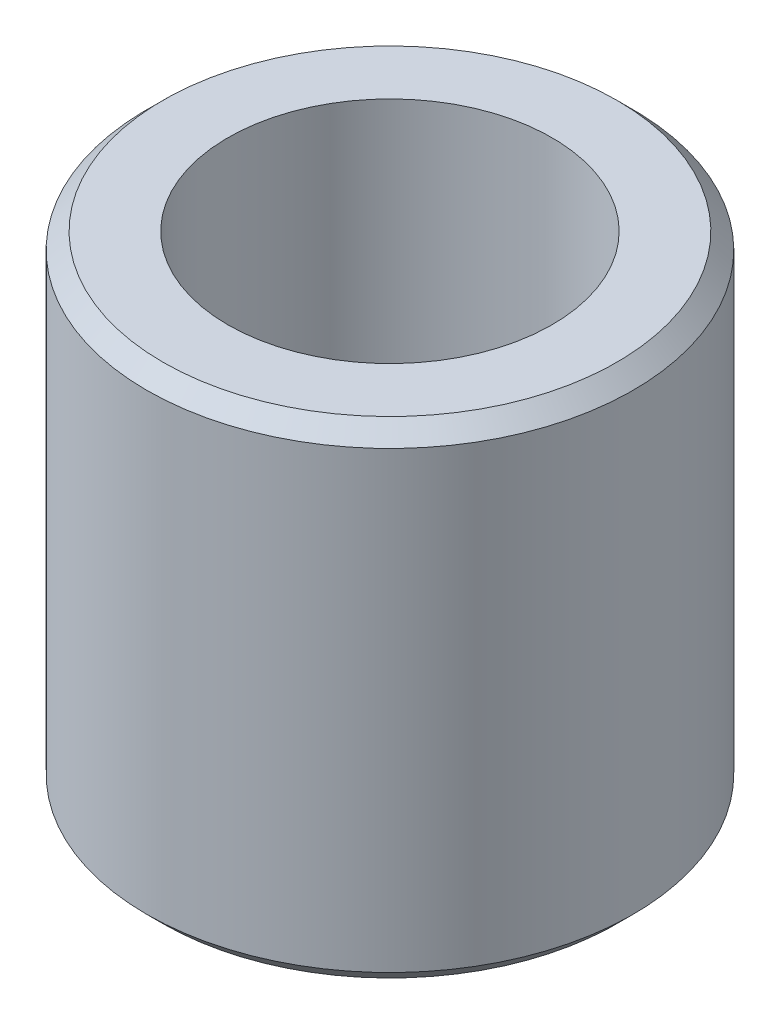
ISO-10303-21;
HEADER;
FILE_DESCRIPTION(('STEP AP214'),'2;1');
FILE_NAME('part.step','',(''),(''),'','','');
FILE_SCHEMA(('AUTOMOTIVE_DESIGN { 1 0 10303 214 1 1 1 1 }'));
ENDSEC;
DATA;
#1=APPLICATION_CONTEXT('core data for automotive mechanical design processes');
#2=APPLICATION_PROTOCOL_DEFINITION('international standard','automotive_design',2000,#1);
#3=PRODUCT_CONTEXT('',#1,'mechanical');
#4=PRODUCT('Part','Part','',(#3));
#5=PRODUCT_RELATED_PRODUCT_CATEGORY('part','',(#4));
#6=PRODUCT_DEFINITION_FORMATION('','',#4);
#7=PRODUCT_DEFINITION_CONTEXT('part definition',#1,'design');
#8=PRODUCT_DEFINITION('design','',#6,#7);
#9=PRODUCT_DEFINITION_SHAPE('','',#8);
#10=(LENGTH_UNIT() NAMED_UNIT(*) SI_UNIT(.MILLI.,.METRE.));
#11=(NAMED_UNIT(*) PLANE_ANGLE_UNIT() SI_UNIT($,.RADIAN.));
#12=(NAMED_UNIT(*) SI_UNIT($,.STERADIAN.) SOLID_ANGLE_UNIT());
#13=UNCERTAINTY_MEASURE_WITH_UNIT(LENGTH_MEASURE(1.E-05),#10,'distance_accuracy_value','');
#14=(GEOMETRIC_REPRESENTATION_CONTEXT(3) GLOBAL_UNCERTAINTY_ASSIGNED_CONTEXT((#13)) GLOBAL_UNIT_ASSIGNED_CONTEXT((#10,
#11,#12)) REPRESENTATION_CONTEXT('',''));
#15=CARTESIAN_POINT('',(0.,0.,0.));
#16=DIRECTION('',(0.,0.,1.));
#17=DIRECTION('',(1.,0.,0.));
#18=AXIS2_PLACEMENT_3D('',#15,#16,#17);
#19=CARTESIAN_POINT('',(0.,15.,0.));
#20=DIRECTION('',(0.,1.,0.));
#21=DIRECTION('',(0.,0.,1.));
#22=AXIS2_PLACEMENT_3D('',#19,#20,#21);
#23=PLANE('',#22);
#24=CARTESIAN_POINT('',(0.,15.,0.));
#25=DIRECTION('',(0.,1.,0.));
#26=DIRECTION('',(0.,0.,1.));
#27=AXIS2_PLACEMENT_3D('',#24,#25,#26);
#28=CIRCLE('',#27,14.);
#29=CARTESIAN_POINT('',(0.,15.,14.));
#30=VERTEX_POINT('',#29);
#31=EDGE_CURVE('E10',#30,#30,#28,.T.);
#32=ORIENTED_EDGE('',*,*,#31,.T.);
#33=EDGE_LOOP('',(#32));
#34=FACE_BOUND('',#33,.T.);
#35=CARTESIAN_POINT('',(0.,15.,0.));
#36=DIRECTION('',(0.,1.,0.));
#37=DIRECTION('',(0.,0.,1.));
#38=AXIS2_PLACEMENT_3D('',#35,#36,#37);
#39=CIRCLE('',#38,10.);
#40=CARTESIAN_POINT('',(0.,15.,10.));
#41=VERTEX_POINT('',#40);
#42=EDGE_CURVE('E66',#41,#41,#39,.T.);
#43=ORIENTED_EDGE('',*,*,#42,.F.);
#44=EDGE_LOOP('',(#43));
#45=FACE_BOUND('',#44,.T.);
#46=ADVANCED_FACE('F41',(#34,#45),#23,.T.);
#47=CARTESIAN_POINT('',(0.,-15.,0.));
#48=DIRECTION('',(0.,1.,0.));
#49=DIRECTION('',(0.,0.,1.));
#50=AXIS2_PLACEMENT_3D('',#47,#48,#49);
#51=PLANE('',#50);
#52=CARTESIAN_POINT('',(0.,-15.,0.));
#53=DIRECTION('',(0.,1.,0.));
#54=DIRECTION('',(0.,0.,1.));
#55=AXIS2_PLACEMENT_3D('',#52,#53,#54);
#56=CIRCLE('',#55,14.);
#57=CARTESIAN_POINT('',(0.,-15.,14.));
#58=VERTEX_POINT('',#57);
#59=EDGE_CURVE('E50',#58,#58,#56,.F.);
#60=ORIENTED_EDGE('',*,*,#59,.T.);
#61=EDGE_LOOP('',(#60));
#62=FACE_BOUND('',#61,.T.);
#63=CARTESIAN_POINT('',(0.,-15.,0.));
#64=DIRECTION('',(0.,1.,0.));
#65=DIRECTION('',(0.,0.,1.));
#66=AXIS2_PLACEMENT_3D('',#63,#64,#65);
#67=CIRCLE('',#66,10.);
#68=CARTESIAN_POINT('',(0.,-15.,10.));
#69=VERTEX_POINT('',#68);
#70=EDGE_CURVE('E67',#69,#69,#67,.T.);
#71=ORIENTED_EDGE('',*,*,#70,.T.);
#72=EDGE_LOOP('',(#71));
#73=FACE_BOUND('',#72,.T.);
#74=ADVANCED_FACE('F79',(#62,#73),#51,.F.);
#75=CARTESIAN_POINT('',(0.,15.,0.));
#76=DIRECTION('',(0.,-1.,0.));
#77=DIRECTION('',(0.,0.,-1.));
#78=AXIS2_PLACEMENT_3D('',#75,#76,#77);
#79=CYLINDRICAL_SURFACE('',#78,15.);
#80=CARTESIAN_POINT('',(0.,-14.,0.));
#81=DIRECTION('',(0.,1.,0.));
#82=DIRECTION('',(0.,0.,1.));
#83=AXIS2_PLACEMENT_3D('',#80,#81,#82);
#84=CIRCLE('',#83,15.);
#85=CARTESIAN_POINT('',(0.,-14.,15.));
#86=VERTEX_POINT('',#85);
#87=EDGE_CURVE('E55',#86,#86,#84,.T.);
#88=ORIENTED_EDGE('',*,*,#87,.T.);
#89=EDGE_LOOP('',(#88));
#90=FACE_BOUND('',#89,.T.);
#91=CARTESIAN_POINT('',(0.,14.,0.));
#92=DIRECTION('',(0.,1.,0.));
#93=DIRECTION('',(0.,0.,1.));
#94=AXIS2_PLACEMENT_3D('',#91,#92,#93);
#95=CIRCLE('',#94,15.);
#96=CARTESIAN_POINT('',(0.,14.,15.));
#97=VERTEX_POINT('',#96);
#98=EDGE_CURVE('E60',#97,#97,#95,.F.);
#99=ORIENTED_EDGE('',*,*,#98,.T.);
#100=EDGE_LOOP('',(#99));
#101=FACE_BOUND('',#100,.T.);
#102=ADVANCED_FACE('F84',(#90,#101),#79,.T.);
#103=CARTESIAN_POINT('',(0.,15.,0.));
#104=DIRECTION('',(0.,-1.,0.));
#105=DIRECTION('',(0.,0.,-1.));
#106=AXIS2_PLACEMENT_3D('',#103,#104,#105);
#107=CYLINDRICAL_SURFACE('',#106,10.);
#108=ORIENTED_EDGE('',*,*,#42,.T.);
#109=EDGE_LOOP('',(#108));
#110=FACE_BOUND('',#109,.T.);
#111=ORIENTED_EDGE('',*,*,#70,.F.);
#112=EDGE_LOOP('',(#111));
#113=FACE_BOUND('',#112,.T.);
#114=ADVANCED_FACE('F75',(#110,#113),#107,.F.);
#115=CARTESIAN_POINT('',(0.,-14.,0.));
#116=DIRECTION('',(0.,1.,0.));
#117=DIRECTION('',(0.,0.,1.));
#118=AXIS2_PLACEMENT_3D('',#115,#116,#117);
#119=CONICAL_SURFACE('',#118,15.,0.785398163397449);
#120=ORIENTED_EDGE('',*,*,#59,.F.);
#121=EDGE_LOOP('',(#120));
#122=FACE_BOUND('',#121,.T.);
#123=ORIENTED_EDGE('',*,*,#87,.F.);
#124=EDGE_LOOP('',(#123));
#125=FACE_BOUND('',#124,.T.);
#126=ADVANCED_FACE('F91',(#122,#125),#119,.T.);
#127=CARTESIAN_POINT('',(0.,15.,0.));
#128=DIRECTION('',(0.,-1.,0.));
#129=DIRECTION('',(0.,0.,-1.));
#130=AXIS2_PLACEMENT_3D('',#127,#128,#129);
#131=CONICAL_SURFACE('',#130,14.,0.785398163397447);
#132=ORIENTED_EDGE('',*,*,#98,.F.);
#133=EDGE_LOOP('',(#132));
#134=FACE_BOUND('',#133,.T.);
#135=ORIENTED_EDGE('',*,*,#31,.F.);
#136=EDGE_LOOP('',(#135));
#137=FACE_BOUND('',#136,.T.);
#138=ADVANCED_FACE('F44',(#134,#137),#131,.T.);
#139=CLOSED_SHELL('',(#46,#74,#102,#114,#126,#138));
#140=MANIFOLD_SOLID_BREP('B2',#139);
#141=ADVANCED_BREP_SHAPE_REPRESENTATION('',(#18,#140),#14);
#142=SHAPE_DEFINITION_REPRESENTATION(#9,#141);
ENDSEC;
END-ISO-10303-21;
